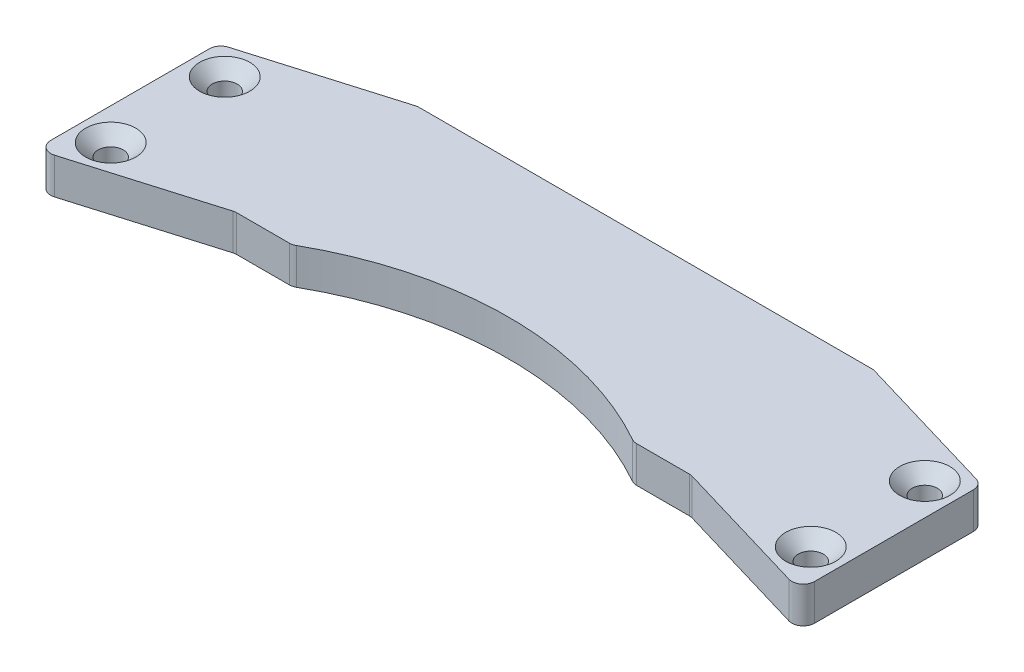
ISO-10303-21;
HEADER;
FILE_DESCRIPTION(('STEP AP214'),'2;1');
FILE_NAME('part.step','',(''),(''),'','','');
FILE_SCHEMA(('AUTOMOTIVE_DESIGN { 1 0 10303 214 1 1 1 1 }'));
ENDSEC;
DATA;
#1=APPLICATION_CONTEXT('core data for automotive mechanical design processes');
#2=APPLICATION_PROTOCOL_DEFINITION('international standard','automotive_design',2000,#1);
#3=PRODUCT_CONTEXT('',#1,'mechanical');
#4=PRODUCT('Part','Part','',(#3));
#5=PRODUCT_RELATED_PRODUCT_CATEGORY('part','',(#4));
#6=PRODUCT_DEFINITION_FORMATION('','',#4);
#7=PRODUCT_DEFINITION_CONTEXT('part definition',#1,'design');
#8=PRODUCT_DEFINITION('design','',#6,#7);
#9=PRODUCT_DEFINITION_SHAPE('','',#8);
#10=(LENGTH_UNIT() NAMED_UNIT(*) SI_UNIT(.MILLI.,.METRE.));
#11=(NAMED_UNIT(*) PLANE_ANGLE_UNIT() SI_UNIT($,.RADIAN.));
#12=(NAMED_UNIT(*) SI_UNIT($,.STERADIAN.) SOLID_ANGLE_UNIT());
#13=UNCERTAINTY_MEASURE_WITH_UNIT(LENGTH_MEASURE(1.E-05),#10,'distance_accuracy_value','');
#14=(GEOMETRIC_REPRESENTATION_CONTEXT(3) GLOBAL_UNCERTAINTY_ASSIGNED_CONTEXT((#13)) GLOBAL_UNIT_ASSIGNED_CONTEXT((#10,
#11,#12)) REPRESENTATION_CONTEXT('',''));
#15=CARTESIAN_POINT('',(0.,0.,0.));
#16=DIRECTION('',(0.,0.,1.));
#17=DIRECTION('',(1.,0.,0.));
#18=AXIS2_PLACEMENT_3D('',#15,#16,#17);
#19=CARTESIAN_POINT('',(-20.,3.175,-4.));
#20=DIRECTION('',(0.,0.,-1.));
#21=DIRECTION('',(-1.,0.,0.));
#22=AXIS2_PLACEMENT_3D('',#19,#20,#21);
#23=PLANE('',#22);
#24=DIRECTION('',(1.,0.,0.));
#25=VECTOR('',#24,1.);
#26=CARTESIAN_POINT('',(-20.,0.,-4.));
#27=LINE('',#26,#25);
#28=CARTESIAN_POINT('',(-19.8549680399178,0.,-4.));
#29=VERTEX_POINT('',#28);
#30=CARTESIAN_POINT('',(-15.2315462117278,0.,-4.));
#31=VERTEX_POINT('',#30);
#32=EDGE_CURVE('E282',#29,#31,#27,.T.);
#33=ORIENTED_EDGE('',*,*,#32,.T.);
#34=DIRECTION('',(0.,1.,0.));
#35=VECTOR('',#34,1.);
#36=CARTESIAN_POINT('',(-15.2315462117278,3.175,-4.));
#37=LINE('',#36,#35);
#38=CARTESIAN_POINT('',(-15.2315462117278,3.175,-4.));
#39=VERTEX_POINT('',#38);
#40=EDGE_CURVE('E235',#31,#39,#37,.T.);
#41=ORIENTED_EDGE('',*,*,#40,.T.);
#42=DIRECTION('',(1.,0.,0.));
#43=VECTOR('',#42,1.);
#44=CARTESIAN_POINT('',(-20.,3.175,-4.));
#45=LINE('',#44,#43);
#46=CARTESIAN_POINT('',(-19.8549680399178,3.175,-4.));
#47=VERTEX_POINT('',#46);
#48=EDGE_CURVE('E193',#47,#39,#45,.T.);
#49=ORIENTED_EDGE('',*,*,#48,.F.);
#50=DIRECTION('',(0.,-1.,0.));
#51=VECTOR('',#50,1.);
#52=CARTESIAN_POINT('',(-19.8549680399178,0.,-4.));
#53=LINE('',#52,#51);
#54=EDGE_CURVE('E182',#47,#29,#53,.T.);
#55=ORIENTED_EDGE('',*,*,#54,.T.);
#56=EDGE_LOOP('',(#33,#41,#49,#55));
#57=FACE_BOUND('',#56,.T.);
#58=ADVANCED_FACE('F33',(#57),#23,.F.);
#59=CARTESIAN_POINT('',(-20.,3.175,-20.));
#60=DIRECTION('',(0.,0.,1.));
#61=DIRECTION('',(1.,0.,0.));
#62=AXIS2_PLACEMENT_3D('',#59,#60,#61);
#63=PLANE('',#62);
#64=DIRECTION('',(-1.,0.,0.));
#65=VECTOR('',#64,1.);
#66=CARTESIAN_POINT('',(-20.,0.,-20.));
#67=LINE('',#66,#65);
#68=CARTESIAN_POINT('',(19.8549680399178,0.,-20.));
#69=VERTEX_POINT('',#68);
#70=CARTESIAN_POINT('',(-19.8549680399178,0.,-20.));
#71=VERTEX_POINT('',#70);
#72=EDGE_CURVE('E299',#69,#71,#67,.T.);
#73=ORIENTED_EDGE('',*,*,#72,.T.);
#74=DIRECTION('',(0.,-1.,0.));
#75=VECTOR('',#74,1.);
#76=CARTESIAN_POINT('',(-19.8549680399178,3.175,-20.));
#77=LINE('',#76,#75);
#78=CARTESIAN_POINT('',(-19.8549680399178,3.175,-20.));
#79=VERTEX_POINT('',#78);
#80=EDGE_CURVE('E265',#71,#79,#77,.F.);
#81=ORIENTED_EDGE('',*,*,#80,.T.);
#82=DIRECTION('',(-1.,0.,0.));
#83=VECTOR('',#82,1.);
#84=CARTESIAN_POINT('',(-20.,3.175,-20.));
#85=LINE('',#84,#83);
#86=CARTESIAN_POINT('',(19.8549680399178,3.175,-20.));
#87=VERTEX_POINT('',#86);
#88=EDGE_CURVE('E307',#87,#79,#85,.T.);
#89=ORIENTED_EDGE('',*,*,#88,.F.);
#90=DIRECTION('',(0.,-1.,0.));
#91=VECTOR('',#90,1.);
#92=CARTESIAN_POINT('',(19.8549680399178,3.175,-20.));
#93=LINE('',#92,#91);
#94=EDGE_CURVE('E262',#87,#69,#93,.T.);
#95=ORIENTED_EDGE('',*,*,#94,.T.);
#96=EDGE_LOOP('',(#73,#81,#89,#95));
#97=FACE_BOUND('',#96,.T.);
#98=ADVANCED_FACE('F381',(#97),#63,.F.);
#99=CARTESIAN_POINT('',(-33.5,3.175,-16.));
#100=DIRECTION('',(0.284088329691374,0.,0.958798112708387));
#101=DIRECTION('',(0.958798112708387,0.,-0.284088329691374));
#102=AXIS2_PLACEMENT_3D('',#99,#100,#101);
#103=PLANE('',#102);
#104=DIRECTION('',(-0.958798112708387,0.,0.284088329691374));
#105=VECTOR('',#104,1.);
#106=CARTESIAN_POINT('',(-33.5,0.,-16.));
#107=LINE('',#106,#105);
#108=CARTESIAN_POINT('',(-20.1390563696092,0.,-19.9587981127084));
#109=VERTEX_POINT('',#108);
#110=CARTESIAN_POINT('',(-32.7840883296914,0.,-16.2121219763877));
#111=VERTEX_POINT('',#110);
#112=EDGE_CURVE('E302',#109,#111,#107,.T.);
#113=ORIENTED_EDGE('',*,*,#112,.T.);
#114=DIRECTION('',(0.,-1.,0.));
#115=VECTOR('',#114,1.);
#116=CARTESIAN_POINT('',(-32.7840883296914,3.175,-16.2121219763877));
#117=LINE('',#116,#115);
#118=CARTESIAN_POINT('',(-32.7840883296914,3.175,-16.2121219763877));
#119=VERTEX_POINT('',#118);
#120=EDGE_CURVE('E260',#111,#119,#117,.F.);
#121=ORIENTED_EDGE('',*,*,#120,.T.);
#122=DIRECTION('',(-0.958798112708387,0.,0.284088329691374));
#123=VECTOR('',#122,1.);
#124=CARTESIAN_POINT('',(-33.5,3.175,-16.));
#125=LINE('',#124,#123);
#126=CARTESIAN_POINT('',(-20.1390563696092,3.175,-19.9587981127084));
#127=VERTEX_POINT('',#126);
#128=EDGE_CURVE('E309',#127,#119,#125,.T.);
#129=ORIENTED_EDGE('',*,*,#128,.F.);
#130=DIRECTION('',(0.,-1.,0.));
#131=VECTOR('',#130,1.);
#132=CARTESIAN_POINT('',(-20.1390563696092,3.175,-19.9587981127084));
#133=LINE('',#132,#131);
#134=EDGE_CURVE('E257',#127,#109,#133,.T.);
#135=ORIENTED_EDGE('',*,*,#134,.T.);
#136=EDGE_LOOP('',(#113,#121,#129,#135));
#137=FACE_BOUND('',#136,.T.);
#138=ADVANCED_FACE('F372',(#137),#103,.F.);
#139=CARTESIAN_POINT('',(-33.5,3.175,0.));
#140=DIRECTION('',(1.,0.,0.));
#141=DIRECTION('',(0.,0.,-1.));
#142=AXIS2_PLACEMENT_3D('',#139,#140,#141);
#143=PLANE('',#142);
#144=DIRECTION('',(0.,0.,1.));
#145=VECTOR('',#144,1.);
#146=CARTESIAN_POINT('',(-33.5,0.,0.));
#147=LINE('',#146,#145);
#148=CARTESIAN_POINT('',(-33.5,0.,-15.2533238636794));
#149=VERTEX_POINT('',#148);
#150=CARTESIAN_POINT('',(-33.5,0.,-1.33926872891323));
#151=VERTEX_POINT('',#150);
#152=EDGE_CURVE('E288',#149,#151,#147,.T.);
#153=ORIENTED_EDGE('',*,*,#152,.T.);
#154=DIRECTION('',(0.,-1.,0.));
#155=VECTOR('',#154,1.);
#156=CARTESIAN_POINT('',(-33.5,3.175,-1.33926872891323));
#157=LINE('',#156,#155);
#158=CARTESIAN_POINT('',(-33.5,3.175,-1.33926872891323));
#159=VERTEX_POINT('',#158);
#160=EDGE_CURVE('E255',#151,#159,#157,.F.);
#161=ORIENTED_EDGE('',*,*,#160,.T.);
#162=DIRECTION('',(0.,0.,1.));
#163=VECTOR('',#162,1.);
#164=CARTESIAN_POINT('',(-33.5,3.175,0.));
#165=LINE('',#164,#163);
#166=CARTESIAN_POINT('',(-33.5,3.175,-15.2533238636794));
#167=VERTEX_POINT('',#166);
#168=EDGE_CURVE('E357',#167,#159,#165,.T.);
#169=ORIENTED_EDGE('',*,*,#168,.F.);
#170=DIRECTION('',(0.,-1.,0.));
#171=VECTOR('',#170,1.);
#172=CARTESIAN_POINT('',(-33.5,3.175,-15.2533238636794));
#173=LINE('',#172,#171);
#174=EDGE_CURVE('E252',#167,#149,#173,.T.);
#175=ORIENTED_EDGE('',*,*,#174,.T.);
#176=EDGE_LOOP('',(#153,#161,#169,#175));
#177=FACE_BOUND('',#176,.T.);
#178=ADVANCED_FACE('F366',(#177),#143,.F.);
#179=CARTESIAN_POINT('',(-33.5,3.175,0.));
#180=DIRECTION('',(-0.284088329691374,0.,-0.958798112708387));
#181=DIRECTION('',(-0.958798112708387,0.,0.284088329691374));
#182=AXIS2_PLACEMENT_3D('',#179,#180,#181);
#183=PLANE('',#182);
#184=DIRECTION('',(0.958798112708387,0.,-0.284088329691374));
#185=VECTOR('',#184,1.);
#186=CARTESIAN_POINT('',(-33.5,0.,0.));
#187=LINE('',#186,#185);
#188=CARTESIAN_POINT('',(-32.2159116703086,0.,-0.380470616204848));
#189=VERTEX_POINT('',#188);
#190=CARTESIAN_POINT('',(-20.1390563696092,0.,-3.95879811270839));
#191=VERTEX_POINT('',#190);
#192=EDGE_CURVE('E280',#189,#191,#187,.T.);
#193=ORIENTED_EDGE('',*,*,#192,.T.);
#194=DIRECTION('',(0.,-1.,0.));
#195=VECTOR('',#194,1.);
#196=CARTESIAN_POINT('',(-20.1390563696092,3.175,-3.95879811270839));
#197=LINE('',#196,#195);
#198=CARTESIAN_POINT('',(-20.1390563696092,3.175,-3.95879811270839));
#199=VERTEX_POINT('',#198);
#200=EDGE_CURVE('E48',#191,#199,#197,.F.);
#201=ORIENTED_EDGE('',*,*,#200,.T.);
#202=DIRECTION('',(0.958798112708387,0.,-0.284088329691374));
#203=VECTOR('',#202,1.);
#204=CARTESIAN_POINT('',(-33.5,3.175,0.));
#205=LINE('',#204,#203);
#206=CARTESIAN_POINT('',(-32.2159116703086,3.175,-0.380470616204848));
#207=VERTEX_POINT('',#206);
#208=EDGE_CURVE('E194',#207,#199,#205,.T.);
#209=ORIENTED_EDGE('',*,*,#208,.F.);
#210=DIRECTION('',(0.,-1.,0.));
#211=VECTOR('',#210,1.);
#212=CARTESIAN_POINT('',(-32.2159116703086,3.175,-0.380470616204848));
#213=LINE('',#212,#211);
#214=EDGE_CURVE('E248',#207,#189,#213,.T.);
#215=ORIENTED_EDGE('',*,*,#214,.T.);
#216=EDGE_LOOP('',(#193,#201,#209,#215));
#217=FACE_BOUND('',#216,.T.);
#218=ADVANCED_FACE('F285',(#217),#183,.F.);
#219=CARTESIAN_POINT('',(15.2315462117278,3.175,-4.));
#220=VERTEX_POINT('',#219);
#221=CARTESIAN_POINT('',(19.8549680399178,3.175,-4.));
#222=VERTEX_POINT('',#221);
#223=EDGE_CURVE('E175',#220,#222,#45,.T.);
#224=ORIENTED_EDGE('',*,*,#223,.F.);
#225=DIRECTION('',(0.,1.,0.));
#226=VECTOR('',#225,1.);
#227=CARTESIAN_POINT('',(15.2315462117278,3.175,-4.));
#228=LINE('',#227,#226);
#229=CARTESIAN_POINT('',(15.2315462117278,0.,-4.));
#230=VERTEX_POINT('',#229);
#231=EDGE_CURVE('E189',#220,#230,#228,.F.);
#232=ORIENTED_EDGE('',*,*,#231,.T.);
#233=CARTESIAN_POINT('',(19.8549680399178,0.,-4.));
#234=VERTEX_POINT('',#233);
#235=EDGE_CURVE('E287',#230,#234,#27,.T.);
#236=ORIENTED_EDGE('',*,*,#235,.T.);
#237=DIRECTION('',(0.,-1.,0.));
#238=VECTOR('',#237,1.);
#239=CARTESIAN_POINT('',(19.8549680399178,3.175,-4.));
#240=LINE('',#239,#238);
#241=EDGE_CURVE('E192',#234,#222,#240,.F.);
#242=ORIENTED_EDGE('',*,*,#241,.T.);
#243=EDGE_LOOP('',(#224,#232,#236,#242));
#244=FACE_BOUND('',#243,.T.);
#245=ADVANCED_FACE('F187',(#244),#23,.F.);
#246=CARTESIAN_POINT('',(0.,3.175,0.));
#247=DIRECTION('',(0.,-1.,0.));
#248=DIRECTION('',(0.,0.,-1.));
#249=AXIS2_PLACEMENT_3D('',#246,#247,#248);
#250=PLANE('',#249);
#251=CARTESIAN_POINT('',(-30.7,3.175,-13.8));
#252=DIRECTION('',(0.,1.,0.));
#253=DIRECTION('',(0.,0.,1.));
#254=AXIS2_PLACEMENT_3D('',#251,#252,#253);
#255=CIRCLE('',#254,2.2);
#256=CARTESIAN_POINT('',(-30.7,3.175,-11.6));
#257=VERTEX_POINT('',#256);
#258=EDGE_CURVE('E323',#257,#257,#255,.T.);
#259=ORIENTED_EDGE('',*,*,#258,.F.);
#260=EDGE_LOOP('',(#259));
#261=FACE_BOUND('',#260,.T.);
#262=CARTESIAN_POINT('',(-30.7,3.175,-3.8));
#263=DIRECTION('',(0.,1.,0.));
#264=DIRECTION('',(0.,0.,1.));
#265=AXIS2_PLACEMENT_3D('',#262,#263,#264);
#266=CIRCLE('',#265,2.2);
#267=CARTESIAN_POINT('',(-30.7,3.175,-1.6));
#268=VERTEX_POINT('',#267);
#269=EDGE_CURVE('E348',#268,#268,#266,.T.);
#270=ORIENTED_EDGE('',*,*,#269,.F.);
#271=EDGE_LOOP('',(#270));
#272=FACE_BOUND('',#271,.T.);
#273=CARTESIAN_POINT('',(0.,3.175,22.));
#274=DIRECTION('',(0.,1.,0.));
#275=DIRECTION('',(0.,0.,1.));
#276=AXIS2_PLACEMENT_3D('',#273,#274,#275);
#277=CIRCLE('',#276,30.);
#278=CARTESIAN_POINT('',(14.7402060113495,3.175,-4.12903225806452));
#279=VERTEX_POINT('',#278);
#280=CARTESIAN_POINT('',(-14.7402060113495,3.175,-4.12903225806452));
#281=VERTEX_POINT('',#280);
#282=EDGE_CURVE('E178',#279,#281,#277,.T.);
#283=ORIENTED_EDGE('',*,*,#282,.F.);
#284=CARTESIAN_POINT('',(15.2315462117278,3.175,-5.));
#285=DIRECTION('',(0.,-1.,0.));
#286=DIRECTION('',(0.,0.,-1.));
#287=AXIS2_PLACEMENT_3D('',#284,#285,#286);
#288=CIRCLE('',#287,1.);
#289=EDGE_CURVE('E171',#279,#220,#288,.F.);
#290=ORIENTED_EDGE('',*,*,#289,.T.);
#291=ORIENTED_EDGE('',*,*,#223,.T.);
#292=CARTESIAN_POINT('',(19.8549680399178,3.175,-3.));
#293=DIRECTION('',(0.,-1.,0.));
#294=DIRECTION('',(0.,0.,-1.));
#295=AXIS2_PLACEMENT_3D('',#292,#293,#294);
#296=CIRCLE('',#295,1.);
#297=CARTESIAN_POINT('',(20.1390563696092,3.175,-3.95879811270839));
#298=VERTEX_POINT('',#297);
#299=EDGE_CURVE('E274',#222,#298,#296,.T.);
#300=ORIENTED_EDGE('',*,*,#299,.T.);
#301=DIRECTION('',(-0.958798112708387,0.,-0.284088329691374));
#302=VECTOR('',#301,1.);
#303=CARTESIAN_POINT('',(33.5,3.175,0.));
#304=LINE('',#303,#302);
#305=CARTESIAN_POINT('',(32.2159116703086,3.175,-0.380470616204848));
#306=VERTEX_POINT('',#305);
#307=EDGE_CURVE('E316',#306,#298,#304,.T.);
#308=ORIENTED_EDGE('',*,*,#307,.F.);
#309=CARTESIAN_POINT('',(32.5,3.175,-1.33926872891324));
#310=DIRECTION('',(0.,-1.,0.));
#311=DIRECTION('',(0.,0.,-1.));
#312=AXIS2_PLACEMENT_3D('',#309,#310,#311);
#313=CIRCLE('',#312,1.);
#314=CARTESIAN_POINT('',(33.5,3.175,-1.33926872891323));
#315=VERTEX_POINT('',#314);
#316=EDGE_CURVE('E230',#306,#315,#313,.F.);
#317=ORIENTED_EDGE('',*,*,#316,.T.);
#318=DIRECTION('',(0.,0.,1.));
#319=VECTOR('',#318,1.);
#320=CARTESIAN_POINT('',(33.5,3.175,0.));
#321=LINE('',#320,#319);
#322=CARTESIAN_POINT('',(33.5,3.175,-15.2533238636794));
#323=VERTEX_POINT('',#322);
#324=EDGE_CURVE('E324',#323,#315,#321,.T.);
#325=ORIENTED_EDGE('',*,*,#324,.F.);
#326=CARTESIAN_POINT('',(32.5,3.175,-15.2533238636794));
#327=DIRECTION('',(0.,-1.,0.));
#328=DIRECTION('',(0.,0.,-1.));
#329=AXIS2_PLACEMENT_3D('',#326,#327,#328);
#330=CIRCLE('',#329,1.);
#331=CARTESIAN_POINT('',(32.7840883296914,3.175,-16.2121219763877));
#332=VERTEX_POINT('',#331);
#333=EDGE_CURVE('E221',#323,#332,#330,.F.);
#334=ORIENTED_EDGE('',*,*,#333,.T.);
#335=DIRECTION('',(0.958798112708387,0.,0.284088329691374));
#336=VECTOR('',#335,1.);
#337=CARTESIAN_POINT('',(33.5,3.175,-16.));
#338=LINE('',#337,#336);
#339=CARTESIAN_POINT('',(20.1390563696092,3.175,-19.9587981127084));
#340=VERTEX_POINT('',#339);
#341=EDGE_CURVE('E330',#340,#332,#338,.T.);
#342=ORIENTED_EDGE('',*,*,#341,.F.);
#343=CARTESIAN_POINT('',(19.8549680399178,3.175,-19.));
#344=DIRECTION('',(0.,-1.,0.));
#345=DIRECTION('',(0.,0.,-1.));
#346=AXIS2_PLACEMENT_3D('',#343,#344,#345);
#347=CIRCLE('',#346,1.);
#348=EDGE_CURVE('E223',#340,#87,#347,.F.);
#349=ORIENTED_EDGE('',*,*,#348,.T.);
#350=ORIENTED_EDGE('',*,*,#88,.T.);
#351=CARTESIAN_POINT('',(-19.8549680399178,3.175,-19.));
#352=DIRECTION('',(0.,-1.,0.));
#353=DIRECTION('',(0.,0.,-1.));
#354=AXIS2_PLACEMENT_3D('',#351,#352,#353);
#355=CIRCLE('',#354,1.);
#356=EDGE_CURVE('E225',#79,#127,#355,.F.);
#357=ORIENTED_EDGE('',*,*,#356,.T.);
#358=ORIENTED_EDGE('',*,*,#128,.T.);
#359=CARTESIAN_POINT('',(-32.5,3.175,-15.2533238636794));
#360=DIRECTION('',(0.,-1.,0.));
#361=DIRECTION('',(0.,0.,-1.));
#362=AXIS2_PLACEMENT_3D('',#359,#360,#361);
#363=CIRCLE('',#362,1.);
#364=EDGE_CURVE('E227',#119,#167,#363,.F.);
#365=ORIENTED_EDGE('',*,*,#364,.T.);
#366=ORIENTED_EDGE('',*,*,#168,.T.);
#367=CARTESIAN_POINT('',(-32.5,3.175,-1.33926872891324));
#368=DIRECTION('',(0.,-1.,0.));
#369=DIRECTION('',(0.,0.,-1.));
#370=AXIS2_PLACEMENT_3D('',#367,#368,#369);
#371=CIRCLE('',#370,1.);
#372=EDGE_CURVE('E55',#159,#207,#371,.F.);
#373=ORIENTED_EDGE('',*,*,#372,.T.);
#374=ORIENTED_EDGE('',*,*,#208,.T.);
#375=CARTESIAN_POINT('',(-19.8549680399178,3.175,-3.));
#376=DIRECTION('',(0.,-1.,0.));
#377=DIRECTION('',(0.,0.,-1.));
#378=AXIS2_PLACEMENT_3D('',#375,#376,#377);
#379=CIRCLE('',#378,1.);
#380=EDGE_CURVE('E11',#199,#47,#379,.T.);
#381=ORIENTED_EDGE('',*,*,#380,.T.);
#382=ORIENTED_EDGE('',*,*,#48,.T.);
#383=CARTESIAN_POINT('',(-15.2315462117278,3.175,-5.));
#384=DIRECTION('',(0.,-1.,0.));
#385=DIRECTION('',(0.,0.,-1.));
#386=AXIS2_PLACEMENT_3D('',#383,#384,#385);
#387=CIRCLE('',#386,1.);
#388=EDGE_CURVE('E183',#39,#281,#387,.F.);
#389=ORIENTED_EDGE('',*,*,#388,.T.);
#390=EDGE_LOOP('',(#283,#290,#291,#300,#308,#317,#325,#334,#342,#349,#350,#357,#358,#365,#366,
#373,#374,#381,#382,#389));
#391=FACE_BOUND('',#390,.T.);
#392=CARTESIAN_POINT('',(30.7,3.175,-13.8));
#393=DIRECTION('',(0.,-1.,0.));
#394=DIRECTION('',(0.,0.,1.));
#395=AXIS2_PLACEMENT_3D('',#392,#393,#394);
#396=CIRCLE('',#395,2.2);
#397=CARTESIAN_POINT('',(30.7,3.175,-11.6));
#398=VERTEX_POINT('',#397);
#399=EDGE_CURVE('E419',#398,#398,#396,.T.);
#400=ORIENTED_EDGE('',*,*,#399,.T.);
#401=EDGE_LOOP('',(#400));
#402=FACE_BOUND('',#401,.T.);
#403=CARTESIAN_POINT('',(30.7,3.175,-3.8));
#404=DIRECTION('',(0.,-1.,0.));
#405=DIRECTION('',(0.,0.,1.));
#406=AXIS2_PLACEMENT_3D('',#403,#404,#405);
#407=CIRCLE('',#406,2.2);
#408=CARTESIAN_POINT('',(30.7,3.175,-1.6));
#409=VERTEX_POINT('',#408);
#410=EDGE_CURVE('E410',#409,#409,#407,.T.);
#411=ORIENTED_EDGE('',*,*,#410,.T.);
#412=EDGE_LOOP('',(#411));
#413=FACE_BOUND('',#412,.T.);
#414=ADVANCED_FACE('F173',(#261,#272,#391,#402,#413),#250,.F.);
#415=CARTESIAN_POINT('',(0.,0.,0.));
#416=DIRECTION('',(0.,-1.,0.));
#417=DIRECTION('',(0.,0.,-1.));
#418=AXIS2_PLACEMENT_3D('',#415,#416,#417);
#419=PLANE('',#418);
#420=ORIENTED_EDGE('',*,*,#235,.F.);
#421=CARTESIAN_POINT('',(15.2315462117278,0.,-5.));
#422=DIRECTION('',(0.,-1.,0.));
#423=DIRECTION('',(0.,0.,-1.));
#424=AXIS2_PLACEMENT_3D('',#421,#422,#423);
#425=CIRCLE('',#424,1.);
#426=CARTESIAN_POINT('',(14.7402060113495,0.,-4.12903225806452));
#427=VERTEX_POINT('',#426);
#428=EDGE_CURVE('E197',#230,#427,#425,.T.);
#429=ORIENTED_EDGE('',*,*,#428,.T.);
#430=CARTESIAN_POINT('',(0.,0.,22.));
#431=DIRECTION('',(0.,1.,0.));
#432=DIRECTION('',(0.,0.,1.));
#433=AXIS2_PLACEMENT_3D('',#430,#431,#432);
#434=CIRCLE('',#433,30.);
#435=CARTESIAN_POINT('',(-14.7402060113495,0.,-4.12903225806452));
#436=VERTEX_POINT('',#435);
#437=EDGE_CURVE('E422',#427,#436,#434,.T.);
#438=ORIENTED_EDGE('',*,*,#437,.T.);
#439=CARTESIAN_POINT('',(-15.2315462117278,0.,-5.));
#440=DIRECTION('',(0.,-1.,0.));
#441=DIRECTION('',(0.,0.,-1.));
#442=AXIS2_PLACEMENT_3D('',#439,#440,#441);
#443=CIRCLE('',#442,1.);
#444=EDGE_CURVE('E214',#436,#31,#443,.T.);
#445=ORIENTED_EDGE('',*,*,#444,.T.);
#446=ORIENTED_EDGE('',*,*,#32,.F.);
#447=CARTESIAN_POINT('',(-19.8549680399178,0.,-3.));
#448=DIRECTION('',(0.,-1.,0.));
#449=DIRECTION('',(0.,0.,-1.));
#450=AXIS2_PLACEMENT_3D('',#447,#448,#449);
#451=CIRCLE('',#450,1.);
#452=EDGE_CURVE('E41',#29,#191,#451,.F.);
#453=ORIENTED_EDGE('',*,*,#452,.T.);
#454=ORIENTED_EDGE('',*,*,#192,.F.);
#455=CARTESIAN_POINT('',(-32.5,0.,-1.33926872891324));
#456=DIRECTION('',(0.,-1.,0.));
#457=DIRECTION('',(0.,0.,-1.));
#458=AXIS2_PLACEMENT_3D('',#455,#456,#457);
#459=CIRCLE('',#458,1.);
#460=EDGE_CURVE('E210',#189,#151,#459,.T.);
#461=ORIENTED_EDGE('',*,*,#460,.T.);
#462=ORIENTED_EDGE('',*,*,#152,.F.);
#463=CARTESIAN_POINT('',(-32.5,0.,-15.2533238636794));
#464=DIRECTION('',(0.,-1.,0.));
#465=DIRECTION('',(0.,0.,-1.));
#466=AXIS2_PLACEMENT_3D('',#463,#464,#465);
#467=CIRCLE('',#466,1.);
#468=EDGE_CURVE('E208',#149,#111,#467,.T.);
#469=ORIENTED_EDGE('',*,*,#468,.T.);
#470=ORIENTED_EDGE('',*,*,#112,.F.);
#471=CARTESIAN_POINT('',(-19.8549680399178,0.,-19.));
#472=DIRECTION('',(0.,-1.,0.));
#473=DIRECTION('',(0.,0.,-1.));
#474=AXIS2_PLACEMENT_3D('',#471,#472,#473);
#475=CIRCLE('',#474,1.);
#476=EDGE_CURVE('E206',#109,#71,#475,.T.);
#477=ORIENTED_EDGE('',*,*,#476,.T.);
#478=ORIENTED_EDGE('',*,*,#72,.F.);
#479=CARTESIAN_POINT('',(19.8549680399178,0.,-19.));
#480=DIRECTION('',(0.,-1.,0.));
#481=DIRECTION('',(0.,0.,-1.));
#482=AXIS2_PLACEMENT_3D('',#479,#480,#481);
#483=CIRCLE('',#482,1.);
#484=CARTESIAN_POINT('',(20.1390563696092,0.,-19.9587981127084));
#485=VERTEX_POINT('',#484);
#486=EDGE_CURVE('E200',#69,#485,#483,.T.);
#487=ORIENTED_EDGE('',*,*,#486,.T.);
#488=DIRECTION('',(0.958798112708387,0.,0.284088329691374));
#489=VECTOR('',#488,1.);
#490=CARTESIAN_POINT('',(33.5,0.,-16.));
#491=LINE('',#490,#489);
#492=CARTESIAN_POINT('',(32.7840883296914,0.,-16.2121219763877));
#493=VERTEX_POINT('',#492);
#494=EDGE_CURVE('E334',#485,#493,#491,.T.);
#495=ORIENTED_EDGE('',*,*,#494,.T.);
#496=CARTESIAN_POINT('',(32.5,0.,-15.2533238636794));
#497=DIRECTION('',(0.,-1.,0.));
#498=DIRECTION('',(0.,0.,-1.));
#499=AXIS2_PLACEMENT_3D('',#496,#497,#498);
#500=CIRCLE('',#499,1.);
#501=CARTESIAN_POINT('',(33.5,0.,-15.2533238636794));
#502=VERTEX_POINT('',#501);
#503=EDGE_CURVE('E198',#493,#502,#500,.T.);
#504=ORIENTED_EDGE('',*,*,#503,.T.);
#505=DIRECTION('',(0.,0.,1.));
#506=VECTOR('',#505,1.);
#507=CARTESIAN_POINT('',(33.5,0.,0.));
#508=LINE('',#507,#506);
#509=CARTESIAN_POINT('',(33.5,0.,-1.33926872891323));
#510=VERTEX_POINT('',#509);
#511=EDGE_CURVE('E337',#502,#510,#508,.T.);
#512=ORIENTED_EDGE('',*,*,#511,.T.);
#513=CARTESIAN_POINT('',(32.5,0.,-1.33926872891324));
#514=DIRECTION('',(0.,-1.,0.));
#515=DIRECTION('',(0.,0.,-1.));
#516=AXIS2_PLACEMENT_3D('',#513,#514,#515);
#517=CIRCLE('',#516,1.);
#518=CARTESIAN_POINT('',(32.2159116703086,0.,-0.380470616204848));
#519=VERTEX_POINT('',#518);
#520=EDGE_CURVE('E212',#510,#519,#517,.T.);
#521=ORIENTED_EDGE('',*,*,#520,.T.);
#522=DIRECTION('',(-0.958798112708387,0.,-0.284088329691374));
#523=VECTOR('',#522,1.);
#524=CARTESIAN_POINT('',(33.5,0.,0.));
#525=LINE('',#524,#523);
#526=CARTESIAN_POINT('',(20.1390563696092,0.,-3.95879811270839));
#527=VERTEX_POINT('',#526);
#528=EDGE_CURVE('E341',#519,#527,#525,.T.);
#529=ORIENTED_EDGE('',*,*,#528,.T.);
#530=CARTESIAN_POINT('',(19.8549680399178,0.,-3.));
#531=DIRECTION('',(0.,-1.,0.));
#532=DIRECTION('',(0.,0.,-1.));
#533=AXIS2_PLACEMENT_3D('',#530,#531,#532);
#534=CIRCLE('',#533,1.);
#535=EDGE_CURVE('E272',#527,#234,#534,.F.);
#536=ORIENTED_EDGE('',*,*,#535,.T.);
#537=EDGE_LOOP('',(#420,#429,#438,#445,#446,#453,#454,#461,#462,#469,#470,#477,#478,#487,#495,
#504,#512,#521,#529,#536));
#538=FACE_BOUND('',#537,.T.);
#539=CARTESIAN_POINT('',(-30.7,0.,-13.8));
#540=DIRECTION('',(0.,1.,0.));
#541=DIRECTION('',(0.,0.,1.));
#542=AXIS2_PLACEMENT_3D('',#539,#540,#541);
#543=CIRCLE('',#542,1.1);
#544=CARTESIAN_POINT('',(-30.7,0.,-12.7));
#545=VERTEX_POINT('',#544);
#546=EDGE_CURVE('E345',#545,#545,#543,.T.);
#547=ORIENTED_EDGE('',*,*,#546,.T.);
#548=EDGE_LOOP('',(#547));
#549=FACE_BOUND('',#548,.T.);
#550=CARTESIAN_POINT('',(-30.7,0.,-3.8));
#551=DIRECTION('',(0.,1.,0.));
#552=DIRECTION('',(0.,0.,1.));
#553=AXIS2_PLACEMENT_3D('',#550,#551,#552);
#554=CIRCLE('',#553,1.1);
#555=CARTESIAN_POINT('',(-30.7,0.,-2.7));
#556=VERTEX_POINT('',#555);
#557=EDGE_CURVE('E303',#556,#556,#554,.T.);
#558=ORIENTED_EDGE('',*,*,#557,.T.);
#559=EDGE_LOOP('',(#558));
#560=FACE_BOUND('',#559,.T.);
#561=CARTESIAN_POINT('',(30.7,0.,-13.8));
#562=DIRECTION('',(0.,-1.,0.));
#563=DIRECTION('',(0.,0.,1.));
#564=AXIS2_PLACEMENT_3D('',#561,#562,#563);
#565=CIRCLE('',#564,1.1);
#566=CARTESIAN_POINT('',(30.7,0.,-12.7));
#567=VERTEX_POINT('',#566);
#568=EDGE_CURVE('E413',#567,#567,#565,.T.);
#569=ORIENTED_EDGE('',*,*,#568,.F.);
#570=EDGE_LOOP('',(#569));
#571=FACE_BOUND('',#570,.T.);
#572=CARTESIAN_POINT('',(30.7,0.,-3.8));
#573=DIRECTION('',(0.,-1.,0.));
#574=DIRECTION('',(0.,0.,1.));
#575=AXIS2_PLACEMENT_3D('',#572,#573,#574);
#576=CIRCLE('',#575,1.1);
#577=CARTESIAN_POINT('',(30.7,0.,-2.7));
#578=VERTEX_POINT('',#577);
#579=EDGE_CURVE('E338',#578,#578,#576,.T.);
#580=ORIENTED_EDGE('',*,*,#579,.F.);
#581=EDGE_LOOP('',(#580));
#582=FACE_BOUND('',#581,.T.);
#583=ADVANCED_FACE('F278',(#538,#549,#560,#571,#582),#419,.T.);
#584=CARTESIAN_POINT('',(-30.7,3.175,-3.8));
#585=DIRECTION('',(0.,1.,0.));
#586=DIRECTION('',(0.,0.,1.));
#587=AXIS2_PLACEMENT_3D('',#584,#585,#586);
#588=CYLINDRICAL_SURFACE('',#587,1.1);
#589=ORIENTED_EDGE('',*,*,#557,.F.);
#590=EDGE_LOOP('',(#589));
#591=FACE_BOUND('',#590,.T.);
#592=CARTESIAN_POINT('',(-30.7,2.075,-3.8));
#593=DIRECTION('',(0.,1.,0.));
#594=DIRECTION('',(0.,0.,1.));
#595=AXIS2_PLACEMENT_3D('',#592,#593,#594);
#596=CIRCLE('',#595,1.1);
#597=CARTESIAN_POINT('',(-30.7,2.075,-2.7));
#598=VERTEX_POINT('',#597);
#599=EDGE_CURVE('E351',#598,#598,#596,.T.);
#600=ORIENTED_EDGE('',*,*,#599,.T.);
#601=EDGE_LOOP('',(#600));
#602=FACE_BOUND('',#601,.T.);
#603=ADVANCED_FACE('F579',(#591,#602),#588,.F.);
#604=CARTESIAN_POINT('',(-30.7,3.175,-3.8));
#605=DIRECTION('',(0.,1.,0.));
#606=DIRECTION('',(0.,0.,1.));
#607=AXIS2_PLACEMENT_3D('',#604,#605,#606);
#608=CONICAL_SURFACE('',#607,2.2,0.785398163397448);
#609=ORIENTED_EDGE('',*,*,#599,.F.);
#610=EDGE_LOOP('',(#609));
#611=FACE_BOUND('',#610,.T.);
#612=ORIENTED_EDGE('',*,*,#269,.T.);
#613=EDGE_LOOP('',(#612));
#614=FACE_BOUND('',#613,.T.);
#615=ADVANCED_FACE('F668',(#611,#614),#608,.F.);
#616=CARTESIAN_POINT('',(-30.7,3.175,-13.8));
#617=DIRECTION('',(0.,1.,0.));
#618=DIRECTION('',(0.,0.,1.));
#619=AXIS2_PLACEMENT_3D('',#616,#617,#618);
#620=CYLINDRICAL_SURFACE('',#619,1.1);
#621=ORIENTED_EDGE('',*,*,#546,.F.);
#622=EDGE_LOOP('',(#621));
#623=FACE_BOUND('',#622,.T.);
#624=CARTESIAN_POINT('',(-30.7,2.075,-13.8));
#625=DIRECTION('',(0.,1.,0.));
#626=DIRECTION('',(0.,0.,1.));
#627=AXIS2_PLACEMENT_3D('',#624,#625,#626);
#628=CIRCLE('',#627,1.1);
#629=CARTESIAN_POINT('',(-30.7,2.075,-12.7));
#630=VERTEX_POINT('',#629);
#631=EDGE_CURVE('E327',#630,#630,#628,.T.);
#632=ORIENTED_EDGE('',*,*,#631,.T.);
#633=EDGE_LOOP('',(#632));
#634=FACE_BOUND('',#633,.T.);
#635=ADVANCED_FACE('F659',(#623,#634),#620,.F.);
#636=CARTESIAN_POINT('',(-30.7,3.175,-13.8));
#637=DIRECTION('',(0.,1.,0.));
#638=DIRECTION('',(0.,0.,1.));
#639=AXIS2_PLACEMENT_3D('',#636,#637,#638);
#640=CONICAL_SURFACE('',#639,2.2,0.785398163397448);
#641=ORIENTED_EDGE('',*,*,#631,.F.);
#642=EDGE_LOOP('',(#641));
#643=FACE_BOUND('',#642,.T.);
#644=ORIENTED_EDGE('',*,*,#258,.T.);
#645=EDGE_LOOP('',(#644));
#646=FACE_BOUND('',#645,.T.);
#647=ADVANCED_FACE('F569',(#643,#646),#640,.F.);
#648=CARTESIAN_POINT('',(33.5,3.175,-16.));
#649=DIRECTION('',(-0.284088329691374,0.,0.958798112708387));
#650=DIRECTION('',(-0.958798112708387,0.,-0.284088329691374));
#651=AXIS2_PLACEMENT_3D('',#648,#649,#650);
#652=PLANE('',#651);
#653=ORIENTED_EDGE('',*,*,#494,.F.);
#654=DIRECTION('',(0.,-1.,0.));
#655=VECTOR('',#654,1.);
#656=CARTESIAN_POINT('',(20.1390563696092,3.175,-19.9587981127084));
#657=LINE('',#656,#655);
#658=EDGE_CURVE('E270',#485,#340,#657,.F.);
#659=ORIENTED_EDGE('',*,*,#658,.T.);
#660=ORIENTED_EDGE('',*,*,#341,.T.);
#661=DIRECTION('',(0.,-1.,0.));
#662=VECTOR('',#661,1.);
#663=CARTESIAN_POINT('',(32.7840883296914,3.175,-16.2121219763877));
#664=LINE('',#663,#662);
#665=EDGE_CURVE('E267',#332,#493,#664,.T.);
#666=ORIENTED_EDGE('',*,*,#665,.T.);
#667=EDGE_LOOP('',(#653,#659,#660,#666));
#668=FACE_BOUND('',#667,.T.);
#669=ADVANCED_FACE('F390',(#668),#652,.F.);
#670=CARTESIAN_POINT('',(33.5,3.175,0.));
#671=DIRECTION('',(-1.,0.,0.));
#672=DIRECTION('',(0.,0.,-1.));
#673=AXIS2_PLACEMENT_3D('',#670,#671,#672);
#674=PLANE('',#673);
#675=ORIENTED_EDGE('',*,*,#324,.T.);
#676=DIRECTION('',(0.,-1.,0.));
#677=VECTOR('',#676,1.);
#678=CARTESIAN_POINT('',(33.5,3.175,-1.33926872891323));
#679=LINE('',#678,#677);
#680=EDGE_CURVE('E240',#315,#510,#679,.T.);
#681=ORIENTED_EDGE('',*,*,#680,.T.);
#682=ORIENTED_EDGE('',*,*,#511,.F.);
#683=DIRECTION('',(0.,-1.,0.));
#684=VECTOR('',#683,1.);
#685=CARTESIAN_POINT('',(33.5,3.175,-15.2533238636794));
#686=LINE('',#685,#684);
#687=EDGE_CURVE('E238',#502,#323,#686,.F.);
#688=ORIENTED_EDGE('',*,*,#687,.T.);
#689=EDGE_LOOP('',(#675,#681,#682,#688));
#690=FACE_BOUND('',#689,.T.);
#691=ADVANCED_FACE('F399',(#690),#674,.F.);
#692=CARTESIAN_POINT('',(33.5,3.175,0.));
#693=DIRECTION('',(0.284088329691374,0.,-0.958798112708387));
#694=DIRECTION('',(0.958798112708387,0.,0.284088329691374));
#695=AXIS2_PLACEMENT_3D('',#692,#693,#694);
#696=PLANE('',#695);
#697=ORIENTED_EDGE('',*,*,#528,.F.);
#698=DIRECTION('',(0.,-1.,0.));
#699=VECTOR('',#698,1.);
#700=CARTESIAN_POINT('',(32.2159116703086,3.175,-0.380470616204848));
#701=LINE('',#700,#699);
#702=EDGE_CURVE('E246',#519,#306,#701,.F.);
#703=ORIENTED_EDGE('',*,*,#702,.T.);
#704=ORIENTED_EDGE('',*,*,#307,.T.);
#705=DIRECTION('',(0.,-1.,0.));
#706=VECTOR('',#705,1.);
#707=CARTESIAN_POINT('',(20.1390563696092,0.,-3.95879811270839));
#708=LINE('',#707,#706);
#709=EDGE_CURVE('E243',#298,#527,#708,.T.);
#710=ORIENTED_EDGE('',*,*,#709,.T.);
#711=EDGE_LOOP('',(#697,#703,#704,#710));
#712=FACE_BOUND('',#711,.T.);
#713=ADVANCED_FACE('F320',(#712),#696,.F.);
#714=CARTESIAN_POINT('',(30.7,3.175,-3.8));
#715=DIRECTION('',(0.,1.,0.));
#716=DIRECTION('',(0.,0.,1.));
#717=AXIS2_PLACEMENT_3D('',#714,#715,#716);
#718=CYLINDRICAL_SURFACE('',#717,1.1);
#719=ORIENTED_EDGE('',*,*,#579,.T.);
#720=EDGE_LOOP('',(#719));
#721=FACE_BOUND('',#720,.T.);
#722=CARTESIAN_POINT('',(30.7,2.075,-3.8));
#723=DIRECTION('',(0.,-1.,0.));
#724=DIRECTION('',(0.,0.,1.));
#725=AXIS2_PLACEMENT_3D('',#722,#723,#724);
#726=CIRCLE('',#725,1.1);
#727=CARTESIAN_POINT('',(30.7,2.075,-2.7));
#728=VERTEX_POINT('',#727);
#729=EDGE_CURVE('E407',#728,#728,#726,.T.);
#730=ORIENTED_EDGE('',*,*,#729,.F.);
#731=EDGE_LOOP('',(#730));
#732=FACE_BOUND('',#731,.T.);
#733=ADVANCED_FACE('F550',(#721,#732),#718,.F.);
#734=CARTESIAN_POINT('',(30.7,3.175,-3.8));
#735=DIRECTION('',(0.,1.,0.));
#736=DIRECTION('',(0.,0.,1.));
#737=AXIS2_PLACEMENT_3D('',#734,#735,#736);
#738=CONICAL_SURFACE('',#737,2.2,0.785398163397448);
#739=ORIENTED_EDGE('',*,*,#729,.T.);
#740=EDGE_LOOP('',(#739));
#741=FACE_BOUND('',#740,.T.);
#742=ORIENTED_EDGE('',*,*,#410,.F.);
#743=EDGE_LOOP('',(#742));
#744=FACE_BOUND('',#743,.T.);
#745=ADVANCED_FACE('F635',(#741,#744),#738,.F.);
#746=CARTESIAN_POINT('',(30.7,3.175,-13.8));
#747=DIRECTION('',(0.,1.,0.));
#748=DIRECTION('',(0.,0.,1.));
#749=AXIS2_PLACEMENT_3D('',#746,#747,#748);
#750=CYLINDRICAL_SURFACE('',#749,1.1);
#751=ORIENTED_EDGE('',*,*,#568,.T.);
#752=EDGE_LOOP('',(#751));
#753=FACE_BOUND('',#752,.T.);
#754=CARTESIAN_POINT('',(30.7,2.075,-13.8));
#755=DIRECTION('',(0.,-1.,0.));
#756=DIRECTION('',(0.,0.,1.));
#757=AXIS2_PLACEMENT_3D('',#754,#755,#756);
#758=CIRCLE('',#757,1.1);
#759=CARTESIAN_POINT('',(30.7,2.075,-12.7));
#760=VERTEX_POINT('',#759);
#761=EDGE_CURVE('E416',#760,#760,#758,.T.);
#762=ORIENTED_EDGE('',*,*,#761,.F.);
#763=EDGE_LOOP('',(#762));
#764=FACE_BOUND('',#763,.T.);
#765=ADVANCED_FACE('F440',(#753,#764),#750,.F.);
#766=CARTESIAN_POINT('',(30.7,3.175,-13.8));
#767=DIRECTION('',(0.,1.,0.));
#768=DIRECTION('',(0.,0.,1.));
#769=AXIS2_PLACEMENT_3D('',#766,#767,#768);
#770=CONICAL_SURFACE('',#769,2.2,0.785398163397448);
#771=ORIENTED_EDGE('',*,*,#761,.T.);
#772=EDGE_LOOP('',(#771));
#773=FACE_BOUND('',#772,.T.);
#774=ORIENTED_EDGE('',*,*,#399,.F.);
#775=EDGE_LOOP('',(#774));
#776=FACE_BOUND('',#775,.T.);
#777=ADVANCED_FACE('F433',(#773,#776),#770,.F.);
#778=CARTESIAN_POINT('',(0.,0.,22.));
#779=DIRECTION('',(0.,1.,0.));
#780=DIRECTION('',(0.,0.,1.));
#781=AXIS2_PLACEMENT_3D('',#778,#779,#780);
#782=CYLINDRICAL_SURFACE('',#781,30.);
#783=ORIENTED_EDGE('',*,*,#437,.F.);
#784=DIRECTION('',(0.,1.,0.));
#785=VECTOR('',#784,1.);
#786=CARTESIAN_POINT('',(14.7402060113495,0.,-4.12903225806452));
#787=LINE('',#786,#785);
#788=EDGE_CURVE('E219',#427,#279,#787,.T.);
#789=ORIENTED_EDGE('',*,*,#788,.T.);
#790=ORIENTED_EDGE('',*,*,#282,.T.);
#791=DIRECTION('',(0.,1.,0.));
#792=VECTOR('',#791,1.);
#793=CARTESIAN_POINT('',(-14.7402060113495,0.,-4.12903225806452));
#794=LINE('',#793,#792);
#795=EDGE_CURVE('E217',#281,#436,#794,.F.);
#796=ORIENTED_EDGE('',*,*,#795,.T.);
#797=EDGE_LOOP('',(#783,#789,#790,#796));
#798=FACE_BOUND('',#797,.T.);
#799=ADVANCED_FACE('F431',(#798),#782,.F.);
#800=CARTESIAN_POINT('',(15.2315462117278,0.,-5.));
#801=DIRECTION('',(0.,1.,0.));
#802=DIRECTION('',(0.,0.,1.));
#803=AXIS2_PLACEMENT_3D('',#800,#801,#802);
#804=CYLINDRICAL_SURFACE('',#803,1.);
#805=ORIENTED_EDGE('',*,*,#289,.F.);
#806=ORIENTED_EDGE('',*,*,#788,.F.);
#807=ORIENTED_EDGE('',*,*,#428,.F.);
#808=ORIENTED_EDGE('',*,*,#231,.F.);
#809=EDGE_LOOP('',(#805,#806,#807,#808));
#810=FACE_BOUND('',#809,.T.);
#811=ADVANCED_FACE('F196',(#810),#804,.T.);
#812=CARTESIAN_POINT('',(-15.2315462117278,0.,-5.));
#813=DIRECTION('',(0.,1.,0.));
#814=DIRECTION('',(0.,0.,1.));
#815=AXIS2_PLACEMENT_3D('',#812,#813,#814);
#816=CYLINDRICAL_SURFACE('',#815,1.);
#817=ORIENTED_EDGE('',*,*,#444,.F.);
#818=ORIENTED_EDGE('',*,*,#795,.F.);
#819=ORIENTED_EDGE('',*,*,#388,.F.);
#820=ORIENTED_EDGE('',*,*,#40,.F.);
#821=EDGE_LOOP('',(#817,#818,#819,#820));
#822=FACE_BOUND('',#821,.T.);
#823=ADVANCED_FACE('F430',(#822),#816,.T.);
#824=CARTESIAN_POINT('',(32.5,3.175,-1.33926872891324));
#825=DIRECTION('',(0.,-1.,0.));
#826=DIRECTION('',(0.,0.,-1.));
#827=AXIS2_PLACEMENT_3D('',#824,#825,#826);
#828=CYLINDRICAL_SURFACE('',#827,1.);
#829=ORIENTED_EDGE('',*,*,#316,.F.);
#830=ORIENTED_EDGE('',*,*,#702,.F.);
#831=ORIENTED_EDGE('',*,*,#520,.F.);
#832=ORIENTED_EDGE('',*,*,#680,.F.);
#833=EDGE_LOOP('',(#829,#830,#831,#832));
#834=FACE_BOUND('',#833,.T.);
#835=ADVANCED_FACE('F403',(#834),#828,.T.);
#836=CARTESIAN_POINT('',(19.8549680399178,3.175,-3.));
#837=DIRECTION('',(0.,1.,0.));
#838=DIRECTION('',(0.,0.,1.));
#839=AXIS2_PLACEMENT_3D('',#836,#837,#838);
#840=CYLINDRICAL_SURFACE('',#839,1.);
#841=ORIENTED_EDGE('',*,*,#299,.F.);
#842=ORIENTED_EDGE('',*,*,#241,.F.);
#843=ORIENTED_EDGE('',*,*,#535,.F.);
#844=ORIENTED_EDGE('',*,*,#709,.F.);
#845=EDGE_LOOP('',(#841,#842,#843,#844));
#846=FACE_BOUND('',#845,.T.);
#847=ADVANCED_FACE('F312',(#846),#840,.F.);
#848=CARTESIAN_POINT('',(-19.8549680399178,3.175,-3.));
#849=DIRECTION('',(0.,1.,0.));
#850=DIRECTION('',(0.,0.,1.));
#851=AXIS2_PLACEMENT_3D('',#848,#849,#850);
#852=CYLINDRICAL_SURFACE('',#851,1.);
#853=ORIENTED_EDGE('',*,*,#380,.F.);
#854=ORIENTED_EDGE('',*,*,#200,.F.);
#855=ORIENTED_EDGE('',*,*,#452,.F.);
#856=ORIENTED_EDGE('',*,*,#54,.F.);
#857=EDGE_LOOP('',(#853,#854,#855,#856));
#858=FACE_BOUND('',#857,.T.);
#859=ADVANCED_FACE('F291',(#858),#852,.F.);
#860=CARTESIAN_POINT('',(-32.5,3.175,-1.33926872891324));
#861=DIRECTION('',(0.,-1.,0.));
#862=DIRECTION('',(0.,0.,-1.));
#863=AXIS2_PLACEMENT_3D('',#860,#861,#862);
#864=CYLINDRICAL_SURFACE('',#863,1.);
#865=ORIENTED_EDGE('',*,*,#372,.F.);
#866=ORIENTED_EDGE('',*,*,#160,.F.);
#867=ORIENTED_EDGE('',*,*,#460,.F.);
#868=ORIENTED_EDGE('',*,*,#214,.F.);
#869=EDGE_LOOP('',(#865,#866,#867,#868));
#870=FACE_BOUND('',#869,.T.);
#871=ADVANCED_FACE('F364',(#870),#864,.T.);
#872=CARTESIAN_POINT('',(-32.5,3.175,-15.2533238636794));
#873=DIRECTION('',(0.,-1.,0.));
#874=DIRECTION('',(0.,0.,-1.));
#875=AXIS2_PLACEMENT_3D('',#872,#873,#874);
#876=CYLINDRICAL_SURFACE('',#875,1.);
#877=ORIENTED_EDGE('',*,*,#364,.F.);
#878=ORIENTED_EDGE('',*,*,#120,.F.);
#879=ORIENTED_EDGE('',*,*,#468,.F.);
#880=ORIENTED_EDGE('',*,*,#174,.F.);
#881=EDGE_LOOP('',(#877,#878,#879,#880));
#882=FACE_BOUND('',#881,.T.);
#883=ADVANCED_FACE('F368',(#882),#876,.T.);
#884=CARTESIAN_POINT('',(-19.8549680399178,3.175,-19.));
#885=DIRECTION('',(0.,-1.,0.));
#886=DIRECTION('',(0.,0.,-1.));
#887=AXIS2_PLACEMENT_3D('',#884,#885,#886);
#888=CYLINDRICAL_SURFACE('',#887,1.);
#889=ORIENTED_EDGE('',*,*,#356,.F.);
#890=ORIENTED_EDGE('',*,*,#80,.F.);
#891=ORIENTED_EDGE('',*,*,#476,.F.);
#892=ORIENTED_EDGE('',*,*,#134,.F.);
#893=EDGE_LOOP('',(#889,#890,#891,#892));
#894=FACE_BOUND('',#893,.T.);
#895=ADVANCED_FACE('F377',(#894),#888,.T.);
#896=CARTESIAN_POINT('',(19.8549680399178,3.175,-19.));
#897=DIRECTION('',(0.,-1.,0.));
#898=DIRECTION('',(0.,0.,-1.));
#899=AXIS2_PLACEMENT_3D('',#896,#897,#898);
#900=CYLINDRICAL_SURFACE('',#899,1.);
#901=ORIENTED_EDGE('',*,*,#348,.F.);
#902=ORIENTED_EDGE('',*,*,#658,.F.);
#903=ORIENTED_EDGE('',*,*,#486,.F.);
#904=ORIENTED_EDGE('',*,*,#94,.F.);
#905=EDGE_LOOP('',(#901,#902,#903,#904));
#906=FACE_BOUND('',#905,.T.);
#907=ADVANCED_FACE('F386',(#906),#900,.T.);
#908=CARTESIAN_POINT('',(32.5,3.175,-15.2533238636794));
#909=DIRECTION('',(0.,-1.,0.));
#910=DIRECTION('',(0.,0.,-1.));
#911=AXIS2_PLACEMENT_3D('',#908,#909,#910);
#912=CYLINDRICAL_SURFACE('',#911,1.);
#913=ORIENTED_EDGE('',*,*,#333,.F.);
#914=ORIENTED_EDGE('',*,*,#687,.F.);
#915=ORIENTED_EDGE('',*,*,#503,.F.);
#916=ORIENTED_EDGE('',*,*,#665,.F.);
#917=EDGE_LOOP('',(#913,#914,#915,#916));
#918=FACE_BOUND('',#917,.T.);
#919=ADVANCED_FACE('F35',(#918),#912,.T.);
#920=CLOSED_SHELL('',(#58,#98,#138,#178,#218,#245,#414,#583,#603,#615,#635,#647,#669,#691,#713,
#733,#745,#765,#777,#799,#811,#823,#835,#847,#859,#871,#883,#895,#907,#919));
#921=MANIFOLD_SOLID_BREP('B2',#920);
#922=ADVANCED_BREP_SHAPE_REPRESENTATION('',(#18,#921),#14);
#923=SHAPE_DEFINITION_REPRESENTATION(#9,#922);
ENDSEC;
END-ISO-10303-21;
